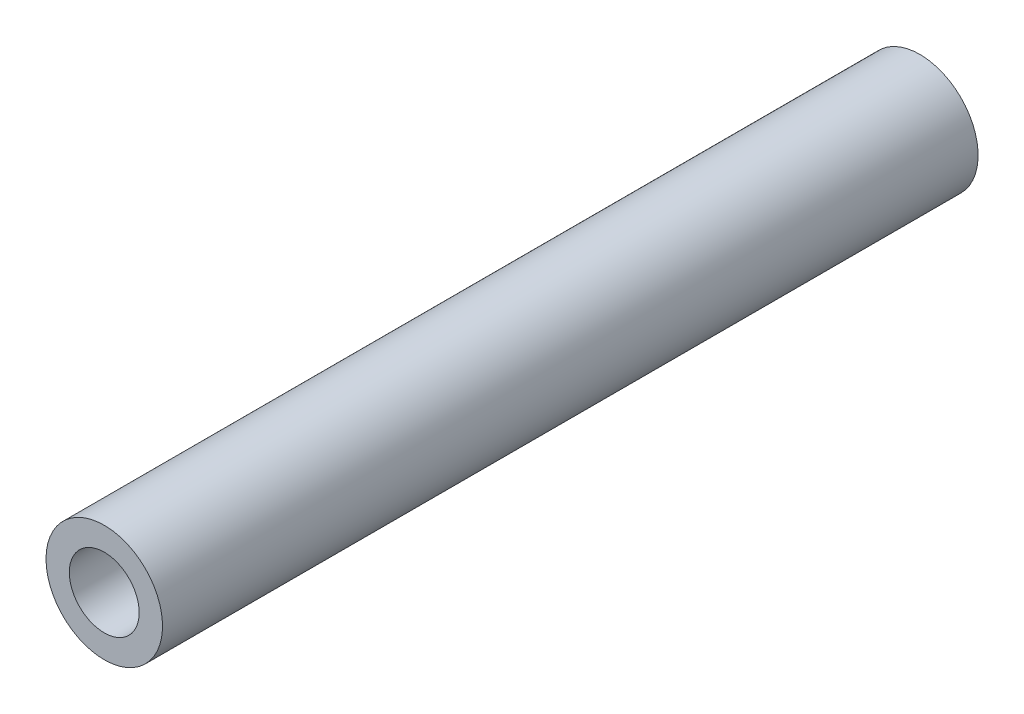
ISO-10303-21;
HEADER;
FILE_DESCRIPTION(('STEP AP214'),'2;1');
FILE_NAME('part.step','',(''),(''),'','','');
FILE_SCHEMA(('AUTOMOTIVE_DESIGN { 1 0 10303 214 1 1 1 1 }'));
ENDSEC;
DATA;
#1=APPLICATION_CONTEXT('core data for automotive mechanical design processes');
#2=APPLICATION_PROTOCOL_DEFINITION('international standard','automotive_design',2000,#1);
#3=PRODUCT_CONTEXT('',#1,'mechanical');
#4=PRODUCT('Part','Part','',(#3));
#5=PRODUCT_RELATED_PRODUCT_CATEGORY('part','',(#4));
#6=PRODUCT_DEFINITION_FORMATION('','',#4);
#7=PRODUCT_DEFINITION_CONTEXT('part definition',#1,'design');
#8=PRODUCT_DEFINITION('design','',#6,#7);
#9=PRODUCT_DEFINITION_SHAPE('','',#8);
#10=(LENGTH_UNIT() NAMED_UNIT(*) SI_UNIT(.MILLI.,.METRE.));
#11=(NAMED_UNIT(*) PLANE_ANGLE_UNIT() SI_UNIT($,.RADIAN.));
#12=(NAMED_UNIT(*) SI_UNIT($,.STERADIAN.) SOLID_ANGLE_UNIT());
#13=UNCERTAINTY_MEASURE_WITH_UNIT(LENGTH_MEASURE(1.E-05),#10,'distance_accuracy_value','');
#14=(GEOMETRIC_REPRESENTATION_CONTEXT(3) GLOBAL_UNCERTAINTY_ASSIGNED_CONTEXT((#13)) GLOBAL_UNIT_ASSIGNED_CONTEXT((#10,
#11,#12)) REPRESENTATION_CONTEXT('',''));
#15=CARTESIAN_POINT('',(0.,0.,0.));
#16=DIRECTION('',(0.,0.,1.));
#17=DIRECTION('',(1.,0.,0.));
#18=AXIS2_PLACEMENT_3D('',#15,#16,#17);
#19=CARTESIAN_POINT('',(0.,0.,21.));
#20=DIRECTION('',(0.,0.,1.));
#21=DIRECTION('',(1.,0.,0.));
#22=AXIS2_PLACEMENT_3D('',#19,#20,#21);
#23=PLANE('',#22);
#24=CARTESIAN_POINT('',(0.,0.,21.));
#25=DIRECTION('',(0.,0.,1.));
#26=DIRECTION('',(1.,0.,0.));
#27=AXIS2_PLACEMENT_3D('',#24,#25,#26);
#28=CIRCLE('',#27,1.5);
#29=CARTESIAN_POINT('',(-1.5,0.,21.));
#30=VERTEX_POINT('',#29);
#31=EDGE_CURVE('E10',#30,#30,#28,.T.);
#32=ORIENTED_EDGE('',*,*,#31,.T.);
#33=EDGE_LOOP('',(#32));
#34=FACE_BOUND('',#33,.T.);
#35=CARTESIAN_POINT('',(0.,0.,21.));
#36=DIRECTION('',(0.,0.,1.));
#37=DIRECTION('',(1.,0.,0.));
#38=AXIS2_PLACEMENT_3D('',#35,#36,#37);
#39=CIRCLE('',#38,0.9);
#40=CARTESIAN_POINT('',(-0.9,0.,21.));
#41=VERTEX_POINT('',#40);
#42=EDGE_CURVE('E41',#41,#41,#39,.T.);
#43=ORIENTED_EDGE('',*,*,#42,.F.);
#44=EDGE_LOOP('',(#43));
#45=FACE_BOUND('',#44,.T.);
#46=ADVANCED_FACE('F30',(#34,#45),#23,.T.);
#47=CARTESIAN_POINT('',(0.,0.,0.));
#48=DIRECTION('',(0.,0.,1.));
#49=DIRECTION('',(1.,0.,0.));
#50=AXIS2_PLACEMENT_3D('',#47,#48,#49);
#51=PLANE('',#50);
#52=CARTESIAN_POINT('',(0.,0.,0.));
#53=DIRECTION('',(0.,0.,1.));
#54=DIRECTION('',(1.,0.,0.));
#55=AXIS2_PLACEMENT_3D('',#52,#53,#54);
#56=CIRCLE('',#55,1.5);
#57=CARTESIAN_POINT('',(-1.5,0.,0.));
#58=VERTEX_POINT('',#57);
#59=EDGE_CURVE('E34',#58,#58,#56,.T.);
#60=ORIENTED_EDGE('',*,*,#59,.F.);
#61=EDGE_LOOP('',(#60));
#62=FACE_BOUND('',#61,.T.);
#63=CARTESIAN_POINT('',(0.,0.,0.));
#64=DIRECTION('',(0.,0.,1.));
#65=DIRECTION('',(1.,0.,0.));
#66=AXIS2_PLACEMENT_3D('',#63,#64,#65);
#67=CIRCLE('',#66,0.9);
#68=CARTESIAN_POINT('',(-0.9,0.,0.));
#69=VERTEX_POINT('',#68);
#70=EDGE_CURVE('E43',#69,#69,#67,.T.);
#71=ORIENTED_EDGE('',*,*,#70,.T.);
#72=EDGE_LOOP('',(#71));
#73=FACE_BOUND('',#72,.T.);
#74=ADVANCED_FACE('F53',(#62,#73),#51,.F.);
#75=CARTESIAN_POINT('',(0.,0.,21.));
#76=DIRECTION('',(0.,0.,-1.));
#77=DIRECTION('',(-1.,0.,0.));
#78=AXIS2_PLACEMENT_3D('',#75,#76,#77);
#79=CYLINDRICAL_SURFACE('',#78,1.5);
#80=CARTESIAN_POINT('',(-1.5,0.,21.));
#81=CARTESIAN_POINT('',(-1.5,0.,20.78125));
#82=CARTESIAN_POINT('',(-1.5,0.,20.5625));
#83=CARTESIAN_POINT('',(-1.5,0.,20.125));
#84=CARTESIAN_POINT('',(-1.5,0.,19.90625));
#85=CARTESIAN_POINT('',(-1.5,0.,19.46875));
#86=CARTESIAN_POINT('',(-1.5,0.,19.25));
#87=CARTESIAN_POINT('',(-1.5,0.,18.8125));
#88=CARTESIAN_POINT('',(-1.5,0.,18.59375));
#89=CARTESIAN_POINT('',(-1.5,0.,18.15625));
#90=CARTESIAN_POINT('',(-1.5,0.,17.9375));
#91=CARTESIAN_POINT('',(-1.5,0.,17.5));
#92=CARTESIAN_POINT('',(-1.5,0.,17.28125));
#93=CARTESIAN_POINT('',(-1.5,0.,16.84375));
#94=CARTESIAN_POINT('',(-1.5,0.,16.625));
#95=CARTESIAN_POINT('',(-1.5,0.,16.1875));
#96=CARTESIAN_POINT('',(-1.5,0.,15.96875));
#97=CARTESIAN_POINT('',(-1.5,0.,15.53125));
#98=CARTESIAN_POINT('',(-1.5,0.,15.3125));
#99=CARTESIAN_POINT('',(-1.5,0.,14.875));
#100=CARTESIAN_POINT('',(-1.5,0.,14.65625));
#101=CARTESIAN_POINT('',(-1.5,0.,14.21875));
#102=CARTESIAN_POINT('',(-1.5,0.,14.));
#103=CARTESIAN_POINT('',(-1.5,0.,13.5625));
#104=CARTESIAN_POINT('',(-1.5,0.,13.34375));
#105=CARTESIAN_POINT('',(-1.5,0.,12.90625));
#106=CARTESIAN_POINT('',(-1.5,0.,12.6875));
#107=CARTESIAN_POINT('',(-1.5,0.,12.25));
#108=CARTESIAN_POINT('',(-1.5,0.,12.03125));
#109=CARTESIAN_POINT('',(-1.5,0.,11.59375));
#110=CARTESIAN_POINT('',(-1.5,0.,11.375));
#111=CARTESIAN_POINT('',(-1.5,0.,10.9375));
#112=CARTESIAN_POINT('',(-1.5,0.,10.71875));
#113=CARTESIAN_POINT('',(-1.5,0.,10.28125));
#114=CARTESIAN_POINT('',(-1.5,0.,10.0625));
#115=CARTESIAN_POINT('',(-1.5,0.,9.625));
#116=CARTESIAN_POINT('',(-1.5,0.,9.40625));
#117=CARTESIAN_POINT('',(-1.5,0.,8.96875));
#118=CARTESIAN_POINT('',(-1.5,0.,8.75));
#119=CARTESIAN_POINT('',(-1.5,0.,8.3125));
#120=CARTESIAN_POINT('',(-1.5,0.,8.09375));
#121=CARTESIAN_POINT('',(-1.5,0.,7.65625));
#122=CARTESIAN_POINT('',(-1.5,0.,7.4375));
#123=CARTESIAN_POINT('',(-1.5,0.,7.));
#124=CARTESIAN_POINT('',(-1.5,0.,6.78125));
#125=CARTESIAN_POINT('',(-1.5,0.,6.34375));
#126=CARTESIAN_POINT('',(-1.5,0.,6.125));
#127=CARTESIAN_POINT('',(-1.5,0.,5.6875));
#128=CARTESIAN_POINT('',(-1.5,0.,5.46875));
#129=CARTESIAN_POINT('',(-1.5,0.,5.03125));
#130=CARTESIAN_POINT('',(-1.5,0.,4.8125));
#131=CARTESIAN_POINT('',(-1.5,0.,4.375));
#132=CARTESIAN_POINT('',(-1.5,0.,4.15625));
#133=CARTESIAN_POINT('',(-1.5,0.,3.71875));
#134=CARTESIAN_POINT('',(-1.5,0.,3.5));
#135=CARTESIAN_POINT('',(-1.5,0.,3.0625));
#136=CARTESIAN_POINT('',(-1.5,0.,2.84375));
#137=CARTESIAN_POINT('',(-1.5,0.,2.40625));
#138=CARTESIAN_POINT('',(-1.5,0.,2.1875));
#139=CARTESIAN_POINT('',(-1.5,0.,1.75));
#140=CARTESIAN_POINT('',(-1.5,0.,1.53125));
#141=CARTESIAN_POINT('',(-1.5,0.,1.09375));
#142=CARTESIAN_POINT('',(-1.5,0.,0.875000000000001));
#143=CARTESIAN_POINT('',(-1.5,0.,0.4375));
#144=CARTESIAN_POINT('',(-1.5,0.,0.21875));
#145=CARTESIAN_POINT('',(-1.5,0.,0.));
#146=B_SPLINE_CURVE_WITH_KNOTS('',3,(#80,#81,#82,#83,#84,#85,#86,#87,#88,#89,#90,#91,#92,#93,
#94,#95,#96,#97,#98,#99,#100,#101,#102,#103,#104,#105,#106,#107,#108,#109,#110,#111,#112,#113,
#114,#115,#116,#117,#118,#119,#120,#121,#122,#123,#124,#125,#126,#127,#128,#129,#130,#131,#132,
#133,#134,#135,#136,#137,#138,#139,#140,#141,#142,#143,#144,#145),.UNSPECIFIED.,.F.,.F.,(4,2,2,
2,2,2,2,2,2,2,2,2,2,2,2,2,2,2,2,2,2,2,2,2,2,2,2,2,2,2,2,2,4),(0.,0.656249999999997,1.3125,
1.96875,2.625,3.28125,3.9375,4.59375,5.25,5.90625,6.5625,7.21875,7.875,8.53125,9.1875,9.84375,
10.5,11.15625,11.8125,12.46875,13.125,13.78125,14.4375,15.09375,15.75,16.40625,17.0625,17.71875,
18.375,19.03125,19.6875,20.34375,21.),.UNSPECIFIED.);
#147=EDGE_CURVE('BSEAM32',#30,#58,#146,.T.);
#148=ORIENTED_EDGE('',*,*,#31,.F.);
#149=ORIENTED_EDGE('',*,*,#59,.T.);
#150=ORIENTED_EDGE('',*,*,#147,.T.);
#151=ORIENTED_EDGE('',*,*,#147,.F.);
#152=EDGE_LOOP('',(#148,#150,#149,#151));
#153=FACE_BOUND('',#152,.T.);
#154=ADVANCED_FACE('F32',(#153),#79,.T.);
#155=CARTESIAN_POINT('',(0.,0.,21.));
#156=DIRECTION('',(0.,0.,-1.));
#157=DIRECTION('',(-1.,0.,0.));
#158=AXIS2_PLACEMENT_3D('',#155,#156,#157);
#159=CYLINDRICAL_SURFACE('',#158,0.9);
#160=CARTESIAN_POINT('',(-0.9,0.,21.));
#161=CARTESIAN_POINT('',(-0.9,0.,20.78125));
#162=CARTESIAN_POINT('',(-0.9,0.,20.5625));
#163=CARTESIAN_POINT('',(-0.9,0.,20.125));
#164=CARTESIAN_POINT('',(-0.9,0.,19.90625));
#165=CARTESIAN_POINT('',(-0.9,0.,19.46875));
#166=CARTESIAN_POINT('',(-0.9,0.,19.25));
#167=CARTESIAN_POINT('',(-0.9,0.,18.8125));
#168=CARTESIAN_POINT('',(-0.9,0.,18.59375));
#169=CARTESIAN_POINT('',(-0.9,0.,18.15625));
#170=CARTESIAN_POINT('',(-0.9,0.,17.9375));
#171=CARTESIAN_POINT('',(-0.9,0.,17.5));
#172=CARTESIAN_POINT('',(-0.9,0.,17.28125));
#173=CARTESIAN_POINT('',(-0.9,0.,16.84375));
#174=CARTESIAN_POINT('',(-0.9,0.,16.625));
#175=CARTESIAN_POINT('',(-0.9,0.,16.1875));
#176=CARTESIAN_POINT('',(-0.9,0.,15.96875));
#177=CARTESIAN_POINT('',(-0.9,0.,15.53125));
#178=CARTESIAN_POINT('',(-0.9,0.,15.3125));
#179=CARTESIAN_POINT('',(-0.9,0.,14.875));
#180=CARTESIAN_POINT('',(-0.9,0.,14.65625));
#181=CARTESIAN_POINT('',(-0.9,0.,14.21875));
#182=CARTESIAN_POINT('',(-0.9,0.,14.));
#183=CARTESIAN_POINT('',(-0.9,0.,13.5625));
#184=CARTESIAN_POINT('',(-0.9,0.,13.34375));
#185=CARTESIAN_POINT('',(-0.9,0.,12.90625));
#186=CARTESIAN_POINT('',(-0.9,0.,12.6875));
#187=CARTESIAN_POINT('',(-0.9,0.,12.25));
#188=CARTESIAN_POINT('',(-0.9,0.,12.03125));
#189=CARTESIAN_POINT('',(-0.9,0.,11.59375));
#190=CARTESIAN_POINT('',(-0.9,0.,11.375));
#191=CARTESIAN_POINT('',(-0.9,0.,10.9375));
#192=CARTESIAN_POINT('',(-0.9,0.,10.71875));
#193=CARTESIAN_POINT('',(-0.9,0.,10.28125));
#194=CARTESIAN_POINT('',(-0.9,0.,10.0625));
#195=CARTESIAN_POINT('',(-0.9,0.,9.625));
#196=CARTESIAN_POINT('',(-0.9,0.,9.40625));
#197=CARTESIAN_POINT('',(-0.9,0.,8.96875));
#198=CARTESIAN_POINT('',(-0.9,0.,8.75));
#199=CARTESIAN_POINT('',(-0.9,0.,8.3125));
#200=CARTESIAN_POINT('',(-0.9,0.,8.09375));
#201=CARTESIAN_POINT('',(-0.9,0.,7.65625));
#202=CARTESIAN_POINT('',(-0.9,0.,7.4375));
#203=CARTESIAN_POINT('',(-0.9,0.,7.));
#204=CARTESIAN_POINT('',(-0.9,0.,6.78125));
#205=CARTESIAN_POINT('',(-0.9,0.,6.34375));
#206=CARTESIAN_POINT('',(-0.9,0.,6.125));
#207=CARTESIAN_POINT('',(-0.9,0.,5.6875));
#208=CARTESIAN_POINT('',(-0.9,0.,5.46875));
#209=CARTESIAN_POINT('',(-0.9,0.,5.03125));
#210=CARTESIAN_POINT('',(-0.9,0.,4.8125));
#211=CARTESIAN_POINT('',(-0.9,0.,4.375));
#212=CARTESIAN_POINT('',(-0.9,0.,4.15625));
#213=CARTESIAN_POINT('',(-0.9,0.,3.71875));
#214=CARTESIAN_POINT('',(-0.9,0.,3.5));
#215=CARTESIAN_POINT('',(-0.9,0.,3.0625));
#216=CARTESIAN_POINT('',(-0.9,0.,2.84375));
#217=CARTESIAN_POINT('',(-0.9,0.,2.40625));
#218=CARTESIAN_POINT('',(-0.9,0.,2.1875));
#219=CARTESIAN_POINT('',(-0.9,0.,1.75));
#220=CARTESIAN_POINT('',(-0.9,0.,1.53125));
#221=CARTESIAN_POINT('',(-0.9,0.,1.09375));
#222=CARTESIAN_POINT('',(-0.9,0.,0.875000000000001));
#223=CARTESIAN_POINT('',(-0.9,0.,0.4375));
#224=CARTESIAN_POINT('',(-0.9,0.,0.21875));
#225=CARTESIAN_POINT('',(-0.9,0.,0.));
#226=B_SPLINE_CURVE_WITH_KNOTS('',3,(#160,#161,#162,#163,#164,#165,#166,#167,#168,#169,#170,
#171,#172,#173,#174,#175,#176,#177,#178,#179,#180,#181,#182,#183,#184,#185,#186,#187,#188,#189,
#190,#191,#192,#193,#194,#195,#196,#197,#198,#199,#200,#201,#202,#203,#204,#205,#206,#207,#208,
#209,#210,#211,#212,#213,#214,#215,#216,#217,#218,#219,#220,#221,#222,#223,#224,#225),
.UNSPECIFIED.,.F.,.F.,(4,2,2,2,2,2,2,2,2,2,2,2,2,2,2,2,2,2,2,2,2,2,2,2,2,2,2,2,2,2,2,2,4),(0.,
0.656249999999997,1.3125,1.96875,2.625,3.28125,3.9375,4.59375,5.25,5.90625,6.5625,7.21875,7.875,
8.53125,9.1875,9.84375,10.5,11.15625,11.8125,12.46875,13.125,13.78125,14.4375,15.09375,15.75,
16.40625,17.0625,17.71875,18.375,19.03125,19.6875,20.34375,21.),.UNSPECIFIED.);
#227=EDGE_CURVE('BSEAM49',#41,#69,#226,.T.);
#228=ORIENTED_EDGE('',*,*,#42,.T.);
#229=ORIENTED_EDGE('',*,*,#70,.F.);
#230=ORIENTED_EDGE('',*,*,#227,.T.);
#231=ORIENTED_EDGE('',*,*,#227,.F.);
#232=EDGE_LOOP('',(#228,#230,#229,#231));
#233=FACE_BOUND('',#232,.T.);
#234=ADVANCED_FACE('F49',(#233),#159,.F.);
#235=CLOSED_SHELL('',(#46,#74,#154,#234));
#236=MANIFOLD_SOLID_BREP('B2',#235);
#237=ADVANCED_BREP_SHAPE_REPRESENTATION('',(#18,#236),#14);
#238=SHAPE_DEFINITION_REPRESENTATION(#9,#237);
ENDSEC;
END-ISO-10303-21;
